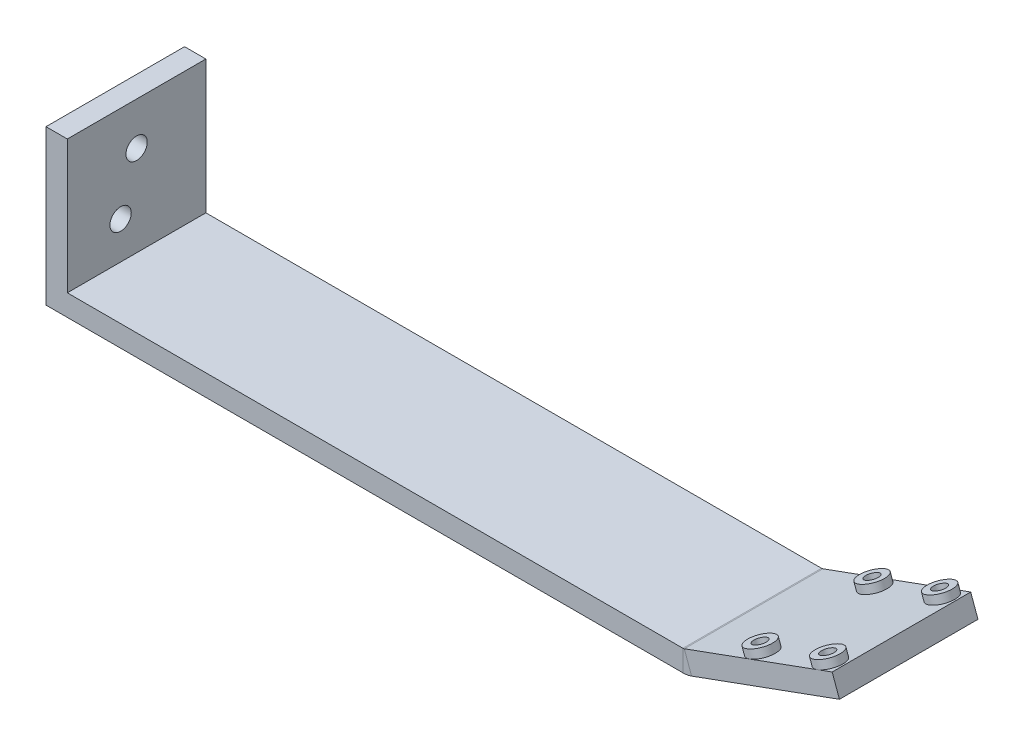
ISO-10303-21;
HEADER;
FILE_DESCRIPTION(('STEP AP214'),'2;1');
FILE_NAME('part.step','',(''),(''),'','','');
FILE_SCHEMA(('AUTOMOTIVE_DESIGN { 1 0 10303 214 1 1 1 1 }'));
ENDSEC;
DATA;
#1=APPLICATION_CONTEXT('core data for automotive mechanical design processes');
#2=APPLICATION_PROTOCOL_DEFINITION('international standard','automotive_design',2000,#1);
#3=PRODUCT_CONTEXT('',#1,'mechanical');
#4=PRODUCT('Part','Part','',(#3));
#5=PRODUCT_RELATED_PRODUCT_CATEGORY('part','',(#4));
#6=PRODUCT_DEFINITION_FORMATION('','',#4);
#7=PRODUCT_DEFINITION_CONTEXT('part definition',#1,'design');
#8=PRODUCT_DEFINITION('design','',#6,#7);
#9=PRODUCT_DEFINITION_SHAPE('','',#8);
#10=(LENGTH_UNIT() NAMED_UNIT(*) SI_UNIT(.MILLI.,.METRE.));
#11=(NAMED_UNIT(*) PLANE_ANGLE_UNIT() SI_UNIT($,.RADIAN.));
#12=(NAMED_UNIT(*) SI_UNIT($,.STERADIAN.) SOLID_ANGLE_UNIT());
#13=UNCERTAINTY_MEASURE_WITH_UNIT(LENGTH_MEASURE(1.E-05),#10,'distance_accuracy_value','');
#14=(GEOMETRIC_REPRESENTATION_CONTEXT(3) GLOBAL_UNCERTAINTY_ASSIGNED_CONTEXT((#13)) GLOBAL_UNIT_ASSIGNED_CONTEXT((#10,
#11,#12)) REPRESENTATION_CONTEXT('',''));
#15=CARTESIAN_POINT('',(0.,0.,0.));
#16=DIRECTION('',(0.,0.,1.));
#17=DIRECTION('',(1.,0.,0.));
#18=AXIS2_PLACEMENT_3D('',#15,#16,#17);
#19=CARTESIAN_POINT('',(0.,0.,0.));
#20=DIRECTION('',(0.,1.,0.));
#21=DIRECTION('',(0.,0.,1.));
#22=AXIS2_PLACEMENT_3D('',#19,#20,#21);
#23=PLANE('',#22);
#24=DIRECTION('',(-1.,0.,0.));
#25=VECTOR('',#24,1.);
#26=CARTESIAN_POINT('',(-75.,0.,-13.));
#27=LINE('',#26,#25);
#28=CARTESIAN_POINT('',(44.5223731968992,0.,-13.));
#29=VERTEX_POINT('',#28);
#30=CARTESIAN_POINT('',(-71.,0.,-13.));
#31=VERTEX_POINT('',#30);
#32=EDGE_CURVE('E65',#29,#31,#27,.T.);
#33=ORIENTED_EDGE('',*,*,#32,.T.);
#34=DIRECTION('',(0.,0.,-1.));
#35=VECTOR('',#34,1.);
#36=CARTESIAN_POINT('',(-71.,0.,13.));
#37=LINE('',#36,#35);
#38=CARTESIAN_POINT('',(-71.,0.,13.));
#39=VERTEX_POINT('',#38);
#40=EDGE_CURVE('E60',#39,#31,#37,.T.);
#41=ORIENTED_EDGE('',*,*,#40,.F.);
#42=DIRECTION('',(1.,0.,0.));
#43=VECTOR('',#42,1.);
#44=CARTESIAN_POINT('',(-75.,0.,13.));
#45=LINE('',#44,#43);
#46=CARTESIAN_POINT('',(44.5223731968992,0.,13.));
#47=VERTEX_POINT('',#46);
#48=EDGE_CURVE('E253',#39,#47,#45,.T.);
#49=ORIENTED_EDGE('',*,*,#48,.T.);
#50=DIRECTION('',(0.,0.,-1.));
#51=VECTOR('',#50,1.);
#52=CARTESIAN_POINT('',(44.5223731968992,0.,0.));
#53=LINE('',#52,#51);
#54=EDGE_CURVE('E251',#47,#29,#53,.T.);
#55=ORIENTED_EDGE('',*,*,#54,.T.);
#56=EDGE_LOOP('',(#33,#41,#49,#55));
#57=FACE_BOUND('',#56,.T.);
#58=ADVANCED_FACE('F43',(#57),#23,.T.);
#59=CARTESIAN_POINT('',(3.40739549004638,-19.2686125049224,0.));
#60=DIRECTION('',(-0.342020143325669,0.939692620785908,0.));
#61=DIRECTION('',(0.,0.,1.));
#62=AXIS2_PLACEMENT_3D('',#59,#60,#61);
#63=PLANE('',#62);
#64=CARTESIAN_POINT('',(71.0652641866318,5.35683781452583,-10.5));
#65=DIRECTION('',(-0.342020143325669,0.939692620785908,0.));
#66=DIRECTION('',(-0.939692620785908,-0.342020143325669,0.));
#67=AXIS2_PLACEMENT_3D('',#64,#65,#66);
#68=CIRCLE('',#67,1.25);
#69=CARTESIAN_POINT('',(69.8906484106494,4.92931263536875,-10.5));
#70=VERTEX_POINT('',#69);
#71=EDGE_CURVE('E186',#70,#70,#68,.T.);
#72=ORIENTED_EDGE('',*,*,#71,.T.);
#73=EDGE_LOOP('',(#72));
#74=FACE_BOUND('',#73,.T.);
#75=CARTESIAN_POINT('',(58.379413806022,0.739565879629296,10.5));
#76=DIRECTION('',(-0.342020143325669,0.939692620785908,0.));
#77=DIRECTION('',(-0.939692620785908,-0.342020143325669,0.));
#78=AXIS2_PLACEMENT_3D('',#75,#76,#77);
#79=CIRCLE('',#78,1.25);
#80=CARTESIAN_POINT('',(57.2047980300396,0.312040700472209,10.5));
#81=VERTEX_POINT('',#80);
#82=EDGE_CURVE('E180',#81,#81,#79,.F.);
#83=ORIENTED_EDGE('',*,*,#82,.F.);
#84=EDGE_LOOP('',(#83));
#85=FACE_BOUND('',#84,.T.);
#86=CARTESIAN_POINT('',(58.379413806022,0.739565879629296,-10.5));
#87=DIRECTION('',(-0.342020143325669,0.939692620785908,0.));
#88=DIRECTION('',(-0.939692620785908,-0.342020143325669,0.));
#89=AXIS2_PLACEMENT_3D('',#86,#87,#88);
#90=CIRCLE('',#89,1.25);
#91=CARTESIAN_POINT('',(57.2047980300396,0.312040700472209,-10.5));
#92=VERTEX_POINT('',#91);
#93=EDGE_CURVE('E173',#92,#92,#90,.T.);
#94=ORIENTED_EDGE('',*,*,#93,.T.);
#95=EDGE_LOOP('',(#94));
#96=FACE_BOUND('',#95,.T.);
#97=CARTESIAN_POINT('',(71.0652641866318,5.35683781452583,10.5));
#98=DIRECTION('',(-0.342020143325669,0.939692620785908,0.));
#99=DIRECTION('',(-0.939692620785908,-0.342020143325669,0.));
#100=AXIS2_PLACEMENT_3D('',#97,#98,#99);
#101=CIRCLE('',#100,1.25);
#102=CARTESIAN_POINT('',(69.8906484106494,4.92931263536875,10.5));
#103=VERTEX_POINT('',#102);
#104=EDGE_CURVE('E191',#103,#103,#101,.F.);
#105=ORIENTED_EDGE('',*,*,#104,.F.);
#106=EDGE_LOOP('',(#105));
#107=FACE_BOUND('',#106,.T.);
#108=DIRECTION('',(0.939692620785908,0.342020143325669,0.));
#109=VECTOR('',#108,1.);
#110=CARTESIAN_POINT('',(-67.0695510688967,-44.9201232543476,13.));
#111=LINE('',#110,#109);
#112=CARTESIAN_POINT('',(46.1423858077756,-3.71434806761453,13.));
#113=VERTEX_POINT('',#112);
#114=CARTESIAN_POINT('',(73.8843420489895,6.38289824450285,13.));
#115=VERTEX_POINT('',#114);
#116=EDGE_CURVE('E47',#113,#115,#111,.T.);
#117=ORIENTED_EDGE('',*,*,#116,.F.);
#118=DIRECTION('',(0.,0.,-1.));
#119=VECTOR('',#118,1.);
#120=CARTESIAN_POINT('',(46.1423858077756,-3.71434806761453,0.));
#121=LINE('',#120,#119);
#122=CARTESIAN_POINT('',(46.1423858077756,-3.71434806761454,-13.));
#123=VERTEX_POINT('',#122);
#124=EDGE_CURVE('E272',#113,#123,#121,.T.);
#125=ORIENTED_EDGE('',*,*,#124,.T.);
#126=DIRECTION('',(-0.939692620785908,-0.342020143325669,0.));
#127=VECTOR('',#126,1.);
#128=CARTESIAN_POINT('',(-67.0695510688967,-44.9201232543476,-13.));
#129=LINE('',#128,#127);
#130=CARTESIAN_POINT('',(73.8843420489895,6.38289824450285,-13.));
#131=VERTEX_POINT('',#130);
#132=EDGE_CURVE('E264',#131,#123,#129,.T.);
#133=ORIENTED_EDGE('',*,*,#132,.F.);
#134=DIRECTION('',(0.,0.,-1.));
#135=VECTOR('',#134,1.);
#136=CARTESIAN_POINT('',(73.8843420489895,6.38289824450285,-13.));
#137=LINE('',#136,#135);
#138=EDGE_CURVE('E261',#115,#131,#137,.T.);
#139=ORIENTED_EDGE('',*,*,#138,.F.);
#140=EDGE_LOOP('',(#117,#125,#133,#139));
#141=FACE_BOUND('',#140,.T.);
#142=ADVANCED_FACE('F333',(#74,#85,#96,#107,#141),#63,.F.);
#143=CARTESIAN_POINT('',(-67.0695510688967,-44.9201232543476,-13.));
#144=DIRECTION('',(0.,0.,-1.));
#145=DIRECTION('',(-0.939692620785908,-0.342020143325669,0.));
#146=AXIS2_PLACEMENT_3D('',#143,#144,#145);
#147=PLANE('',#146);
#148=DIRECTION('',(0.342020143325669,-0.939692620785908,0.));
#149=VECTOR('',#148,1.);
#150=CARTESIAN_POINT('',(46.1423858077756,-3.71434806761453,-13.));
#151=LINE('',#150,#149);
#152=CARTESIAN_POINT('',(44.7743052344729,0.0444224155290995,-13.));
#153=VERTEX_POINT('',#152);
#154=EDGE_CURVE('E12',#153,#123,#151,.T.);
#155=ORIENTED_EDGE('',*,*,#154,.F.);
#156=DIRECTION('',(-0.939692620785908,-0.342020143325669,0.));
#157=VECTOR('',#156,1.);
#158=CARTESIAN_POINT('',(-68.4376316421994,-41.1613527712039,-13.));
#159=LINE('',#158,#157);
#160=CARTESIAN_POINT('',(57.0113332327193,4.49833636277293,-13.));
#161=VERTEX_POINT('',#160);
#162=EDGE_CURVE('E268',#161,#153,#159,.T.);
#163=ORIENTED_EDGE('',*,*,#162,.F.);
#164=CARTESIAN_POINT('',(69.6971836133291,9.11560829766946,-13.));
#165=VERTEX_POINT('',#164);
#166=EDGE_CURVE('E286',#165,#161,#159,.T.);
#167=ORIENTED_EDGE('',*,*,#166,.F.);
#168=CARTESIAN_POINT('',(72.5162614756868,10.1416687276465,-13.));
#169=VERTEX_POINT('',#168);
#170=EDGE_CURVE('E284',#169,#165,#159,.T.);
#171=ORIENTED_EDGE('',*,*,#170,.F.);
#172=DIRECTION('',(-0.342020143325669,0.939692620785908,0.));
#173=VECTOR('',#172,1.);
#174=CARTESIAN_POINT('',(73.8843420489895,6.38289824450285,-13.));
#175=LINE('',#174,#173);
#176=EDGE_CURVE('E270',#131,#169,#175,.T.);
#177=ORIENTED_EDGE('',*,*,#176,.F.);
#178=ORIENTED_EDGE('',*,*,#132,.T.);
#179=EDGE_LOOP('',(#155,#163,#167,#171,#177,#178));
#180=FACE_BOUND('',#179,.T.);
#181=ADVANCED_FACE('F45',(#180),#147,.T.);
#182=CARTESIAN_POINT('',(73.8843420489895,6.38289824450285,-13.));
#183=DIRECTION('',(0.939692620785908,0.342020143325669,0.));
#184=DIRECTION('',(0.,0.,-1.));
#185=AXIS2_PLACEMENT_3D('',#182,#183,#184);
#186=PLANE('',#185);
#187=DIRECTION('',(0.,0.,-1.));
#188=VECTOR('',#187,1.);
#189=CARTESIAN_POINT('',(72.5162614756868,10.1416687276465,-13.));
#190=LINE('',#189,#188);
#191=CARTESIAN_POINT('',(72.5162614756868,10.1416687276465,13.));
#192=VERTEX_POINT('',#191);
#193=EDGE_CURVE('E265',#192,#169,#190,.T.);
#194=ORIENTED_EDGE('',*,*,#193,.F.);
#195=DIRECTION('',(-0.342020143325669,0.939692620785908,0.));
#196=VECTOR('',#195,1.);
#197=CARTESIAN_POINT('',(73.8843420489895,6.38289824450285,13.));
#198=LINE('',#197,#196);
#199=EDGE_CURVE('E273',#115,#192,#198,.T.);
#200=ORIENTED_EDGE('',*,*,#199,.F.);
#201=ORIENTED_EDGE('',*,*,#138,.T.);
#202=ORIENTED_EDGE('',*,*,#176,.T.);
#203=EDGE_LOOP('',(#194,#200,#201,#202));
#204=FACE_BOUND('',#203,.T.);
#205=ADVANCED_FACE('F304',(#204),#186,.T.);
#206=CARTESIAN_POINT('',(-67.0695510688967,-44.9201232543476,13.));
#207=DIRECTION('',(0.,0.,1.));
#208=DIRECTION('',(0.939692620785908,0.342020143325669,0.));
#209=AXIS2_PLACEMENT_3D('',#206,#207,#208);
#210=PLANE('',#209);
#211=DIRECTION('',(-0.342020143325669,0.939692620785908,0.));
#212=VECTOR('',#211,1.);
#213=CARTESIAN_POINT('',(46.1423858077756,-3.71434806761453,13.));
#214=LINE('',#213,#212);
#215=CARTESIAN_POINT('',(44.7743052344729,0.0444224155290995,13.));
#216=VERTEX_POINT('',#215);
#217=EDGE_CURVE('E278',#113,#216,#214,.T.);
#218=ORIENTED_EDGE('',*,*,#217,.F.);
#219=ORIENTED_EDGE('',*,*,#116,.T.);
#220=ORIENTED_EDGE('',*,*,#199,.T.);
#221=DIRECTION('',(0.939692620785908,0.342020143325669,0.));
#222=VECTOR('',#221,1.);
#223=CARTESIAN_POINT('',(-68.4376316421994,-41.1613527712039,13.));
#224=LINE('',#223,#222);
#225=CARTESIAN_POINT('',(69.6971836133291,9.11560829766946,13.));
#226=VERTEX_POINT('',#225);
#227=EDGE_CURVE('E244',#226,#192,#224,.T.);
#228=ORIENTED_EDGE('',*,*,#227,.F.);
#229=CARTESIAN_POINT('',(57.0113332327193,4.49833636277293,13.));
#230=VERTEX_POINT('',#229);
#231=EDGE_CURVE('E288',#230,#226,#224,.T.);
#232=ORIENTED_EDGE('',*,*,#231,.F.);
#233=EDGE_CURVE('E269',#216,#230,#224,.T.);
#234=ORIENTED_EDGE('',*,*,#233,.F.);
#235=EDGE_LOOP('',(#218,#219,#220,#228,#232,#234));
#236=FACE_BOUND('',#235,.T.);
#237=ADVANCED_FACE('F301',(#236),#210,.T.);
#238=CARTESIAN_POINT('',(2.0393149167437,-15.5098420217787,0.));
#239=DIRECTION('',(-0.342020143325669,0.939692620785908,0.));
#240=DIRECTION('',(0.,0.,1.));
#241=AXIS2_PLACEMENT_3D('',#238,#239,#240);
#242=PLANE('',#241);
#243=ORIENTED_EDGE('',*,*,#233,.T.);
#244=CARTESIAN_POINT('',(57.0113332327193,4.49833636277293,10.5));
#245=DIRECTION('',(-0.342020143325669,0.939692620785908,0.));
#246=DIRECTION('',(0.939692620785908,0.342020143325669,0.));
#247=AXIS2_PLACEMENT_3D('',#244,#245,#246);
#248=CIRCLE('',#247,2.5);
#249=EDGE_CURVE('E199',#230,#230,#248,.T.);
#250=ORIENTED_EDGE('',*,*,#249,.F.);
#251=ORIENTED_EDGE('',*,*,#231,.T.);
#252=CARTESIAN_POINT('',(69.6971836133291,9.11560829766946,10.5));
#253=DIRECTION('',(-0.342020143325669,0.939692620785908,0.));
#254=DIRECTION('',(0.939692620785908,0.342020143325669,0.));
#255=AXIS2_PLACEMENT_3D('',#252,#253,#254);
#256=CIRCLE('',#255,2.5);
#257=EDGE_CURVE('E215',#226,#226,#256,.T.);
#258=ORIENTED_EDGE('',*,*,#257,.F.);
#259=ORIENTED_EDGE('',*,*,#227,.T.);
#260=ORIENTED_EDGE('',*,*,#193,.T.);
#261=ORIENTED_EDGE('',*,*,#170,.T.);
#262=CARTESIAN_POINT('',(69.6971836133291,9.11560829766946,-10.5));
#263=DIRECTION('',(-0.342020143325669,0.939692620785908,0.));
#264=DIRECTION('',(-0.939692620785908,-0.342020143325669,0.));
#265=AXIS2_PLACEMENT_3D('',#262,#263,#264);
#266=CIRCLE('',#265,2.5);
#267=EDGE_CURVE('E224',#165,#165,#266,.T.);
#268=ORIENTED_EDGE('',*,*,#267,.F.);
#269=ORIENTED_EDGE('',*,*,#166,.T.);
#270=CARTESIAN_POINT('',(57.0113332327193,4.49833636277293,-10.5));
#271=DIRECTION('',(-0.342020143325669,0.939692620785908,0.));
#272=DIRECTION('',(-0.939692620785908,-0.342020143325669,0.));
#273=AXIS2_PLACEMENT_3D('',#270,#271,#272);
#274=CIRCLE('',#273,2.5);
#275=EDGE_CURVE('E207',#161,#161,#274,.T.);
#276=ORIENTED_EDGE('',*,*,#275,.F.);
#277=ORIENTED_EDGE('',*,*,#162,.T.);
#278=DIRECTION('',(0.,0.,-1.));
#279=VECTOR('',#278,1.);
#280=CARTESIAN_POINT('',(44.7743052344729,0.044422415529103,0.));
#281=LINE('',#280,#279);
#282=EDGE_CURVE('E52',#216,#153,#281,.T.);
#283=ORIENTED_EDGE('',*,*,#282,.F.);
#284=EDGE_LOOP('',(#243,#250,#251,#258,#259,#260,#261,#268,#269,#276,#277,#283));
#285=FACE_BOUND('',#284,.T.);
#286=ADVANCED_FACE('F294',(#285),#242,.T.);
#287=CARTESIAN_POINT('',(-75.,-4.,-13.));
#288=DIRECTION('',(-1.,0.,0.));
#289=DIRECTION('',(0.,0.,1.));
#290=AXIS2_PLACEMENT_3D('',#287,#288,#289);
#291=PLANE('',#290);
#292=CARTESIAN_POINT('',(-75.,7.,3.00000000000004));
#293=DIRECTION('',(1.,0.,0.));
#294=DIRECTION('',(0.,0.,-1.));
#295=AXIS2_PLACEMENT_3D('',#292,#293,#294);
#296=CIRCLE('',#295,2.);
#297=CARTESIAN_POINT('',(-75.,7.,1.00000000000004));
#298=VERTEX_POINT('',#297);
#299=EDGE_CURVE('E160',#298,#298,#296,.T.);
#300=ORIENTED_EDGE('',*,*,#299,.T.);
#301=EDGE_LOOP('',(#300));
#302=FACE_BOUND('',#301,.T.);
#303=CARTESIAN_POINT('',(-75.,17.,0.));
#304=DIRECTION('',(1.,0.,0.));
#305=DIRECTION('',(0.,0.,-1.));
#306=AXIS2_PLACEMENT_3D('',#303,#304,#305);
#307=CIRCLE('',#306,2.);
#308=CARTESIAN_POINT('',(-75.,17.,-1.99999999999996));
#309=VERTEX_POINT('',#308);
#310=EDGE_CURVE('E486',#309,#309,#307,.T.);
#311=ORIENTED_EDGE('',*,*,#310,.T.);
#312=EDGE_LOOP('',(#311));
#313=FACE_BOUND('',#312,.T.);
#314=DIRECTION('',(0.,1.,0.));
#315=VECTOR('',#314,1.);
#316=CARTESIAN_POINT('',(-75.,-4.,13.));
#317=LINE('',#316,#315);
#318=CARTESIAN_POINT('',(-75.,-4.,13.));
#319=VERTEX_POINT('',#318);
#320=CARTESIAN_POINT('',(-75.,25.,13.));
#321=VERTEX_POINT('',#320);
#322=EDGE_CURVE('E133',#319,#321,#317,.T.);
#323=ORIENTED_EDGE('',*,*,#322,.T.);
#324=DIRECTION('',(0.,0.,1.));
#325=VECTOR('',#324,1.);
#326=CARTESIAN_POINT('',(-75.,25.,13.));
#327=LINE('',#326,#325);
#328=CARTESIAN_POINT('',(-75.,25.,-13.));
#329=VERTEX_POINT('',#328);
#330=EDGE_CURVE('E138',#329,#321,#327,.T.);
#331=ORIENTED_EDGE('',*,*,#330,.F.);
#332=DIRECTION('',(0.,1.,0.));
#333=VECTOR('',#332,1.);
#334=CARTESIAN_POINT('',(-75.,-4.,-13.));
#335=LINE('',#334,#333);
#336=CARTESIAN_POINT('',(-75.,-4.,-13.));
#337=VERTEX_POINT('',#336);
#338=EDGE_CURVE('E242',#337,#329,#335,.T.);
#339=ORIENTED_EDGE('',*,*,#338,.F.);
#340=DIRECTION('',(0.,0.,1.));
#341=VECTOR('',#340,1.);
#342=CARTESIAN_POINT('',(-75.,-4.,-13.));
#343=LINE('',#342,#341);
#344=EDGE_CURVE('E140',#337,#319,#343,.T.);
#345=ORIENTED_EDGE('',*,*,#344,.T.);
#346=EDGE_LOOP('',(#323,#331,#339,#345));
#347=FACE_BOUND('',#346,.T.);
#348=ADVANCED_FACE('F135',(#302,#313,#347),#291,.T.);
#349=CARTESIAN_POINT('',(0.,-4.,0.));
#350=DIRECTION('',(0.,1.,0.));
#351=DIRECTION('',(0.,0.,1.));
#352=AXIS2_PLACEMENT_3D('',#349,#350,#351);
#353=PLANE('',#352);
#354=DIRECTION('',(0.,0.,-1.));
#355=VECTOR('',#354,1.);
#356=CARTESIAN_POINT('',(44.5223731968992,-4.,0.));
#357=LINE('',#356,#355);
#358=CARTESIAN_POINT('',(44.5223731968992,-4.,13.));
#359=VERTEX_POINT('',#358);
#360=CARTESIAN_POINT('',(44.5223731968992,-4.,-13.));
#361=VERTEX_POINT('',#360);
#362=EDGE_CURVE('E237',#359,#361,#357,.T.);
#363=ORIENTED_EDGE('',*,*,#362,.F.);
#364=DIRECTION('',(1.,0.,0.));
#365=VECTOR('',#364,1.);
#366=CARTESIAN_POINT('',(-75.,-4.,13.));
#367=LINE('',#366,#365);
#368=EDGE_CURVE('E144',#319,#359,#367,.T.);
#369=ORIENTED_EDGE('',*,*,#368,.F.);
#370=ORIENTED_EDGE('',*,*,#344,.F.);
#371=DIRECTION('',(-1.,0.,0.));
#372=VECTOR('',#371,1.);
#373=CARTESIAN_POINT('',(-75.,-4.,-13.));
#374=LINE('',#373,#372);
#375=EDGE_CURVE('E245',#361,#337,#374,.T.);
#376=ORIENTED_EDGE('',*,*,#375,.F.);
#377=EDGE_LOOP('',(#363,#369,#370,#376));
#378=FACE_BOUND('',#377,.T.);
#379=ADVANCED_FACE('F355',(#378),#353,.F.);
#380=CARTESIAN_POINT('',(-75.,-4.,13.));
#381=DIRECTION('',(0.,0.,1.));
#382=DIRECTION('',(1.,0.,0.));
#383=AXIS2_PLACEMENT_3D('',#380,#381,#382);
#384=PLANE('',#383);
#385=ORIENTED_EDGE('',*,*,#368,.T.);
#386=DIRECTION('',(0.,1.,0.));
#387=VECTOR('',#386,1.);
#388=CARTESIAN_POINT('',(44.5223731968992,-4.,13.));
#389=LINE('',#388,#387);
#390=EDGE_CURVE('E255',#359,#47,#389,.T.);
#391=ORIENTED_EDGE('',*,*,#390,.T.);
#392=ORIENTED_EDGE('',*,*,#48,.F.);
#393=DIRECTION('',(0.,-1.,0.));
#394=VECTOR('',#393,1.);
#395=CARTESIAN_POINT('',(-71.,25.,13.));
#396=LINE('',#395,#394);
#397=CARTESIAN_POINT('',(-71.,25.,13.));
#398=VERTEX_POINT('',#397);
#399=EDGE_CURVE('E150',#398,#39,#396,.T.);
#400=ORIENTED_EDGE('',*,*,#399,.F.);
#401=DIRECTION('',(1.,0.,0.));
#402=VECTOR('',#401,1.);
#403=CARTESIAN_POINT('',(-75.,25.,13.));
#404=LINE('',#403,#402);
#405=EDGE_CURVE('E147',#321,#398,#404,.T.);
#406=ORIENTED_EDGE('',*,*,#405,.F.);
#407=ORIENTED_EDGE('',*,*,#322,.F.);
#408=EDGE_LOOP('',(#385,#391,#392,#400,#406,#407));
#409=FACE_BOUND('',#408,.T.);
#410=ADVANCED_FACE('F148',(#409),#384,.T.);
#411=CARTESIAN_POINT('',(-75.,-4.,-13.));
#412=DIRECTION('',(0.,0.,-1.));
#413=DIRECTION('',(-1.,0.,0.));
#414=AXIS2_PLACEMENT_3D('',#411,#412,#413);
#415=PLANE('',#414);
#416=ORIENTED_EDGE('',*,*,#32,.F.);
#417=DIRECTION('',(0.,-1.,0.));
#418=VECTOR('',#417,1.);
#419=CARTESIAN_POINT('',(44.5223731968992,-4.,-13.));
#420=LINE('',#419,#418);
#421=EDGE_CURVE('E247',#29,#361,#420,.T.);
#422=ORIENTED_EDGE('',*,*,#421,.T.);
#423=ORIENTED_EDGE('',*,*,#375,.T.);
#424=ORIENTED_EDGE('',*,*,#338,.T.);
#425=DIRECTION('',(-1.,0.,0.));
#426=VECTOR('',#425,1.);
#427=CARTESIAN_POINT('',(-75.,25.,-13.));
#428=LINE('',#427,#426);
#429=CARTESIAN_POINT('',(-71.,25.,-13.));
#430=VERTEX_POINT('',#429);
#431=EDGE_CURVE('E158',#430,#329,#428,.T.);
#432=ORIENTED_EDGE('',*,*,#431,.F.);
#433=DIRECTION('',(0.,-1.,0.));
#434=VECTOR('',#433,1.);
#435=CARTESIAN_POINT('',(-71.,25.,-13.));
#436=LINE('',#435,#434);
#437=EDGE_CURVE('E167',#430,#31,#436,.T.);
#438=ORIENTED_EDGE('',*,*,#437,.T.);
#439=EDGE_LOOP('',(#416,#422,#423,#424,#432,#438));
#440=FACE_BOUND('',#439,.T.);
#441=ADVANCED_FACE('F343',(#440),#415,.T.);
#442=CARTESIAN_POINT('',(44.5223731968992,0.7366,13.));
#443=DIRECTION('',(0.,0.,1.));
#444=DIRECTION('',(1.,0.,0.));
#445=AXIS2_PLACEMENT_3D('',#442,#443,#444);
#446=PLANE('',#445);
#447=ORIENTED_EDGE('',*,*,#217,.T.);
#448=CARTESIAN_POINT('',(44.5223731968992,0.7366,13.));
#449=DIRECTION('',(0.,0.,1.));
#450=DIRECTION('',(1.,0.,0.));
#451=AXIS2_PLACEMENT_3D('',#448,#449,#450);
#452=CIRCLE('',#451,0.7366);
#453=EDGE_CURVE('E228',#216,#47,#452,.F.);
#454=ORIENTED_EDGE('',*,*,#453,.T.);
#455=ORIENTED_EDGE('',*,*,#390,.F.);
#456=CARTESIAN_POINT('',(44.5223731968992,0.7366,13.));
#457=DIRECTION('',(0.,0.,-1.));
#458=DIRECTION('',(1.,0.,0.));
#459=AXIS2_PLACEMENT_3D('',#456,#457,#458);
#460=CIRCLE('',#459,4.7366);
#461=EDGE_CURVE('E230',#113,#359,#460,.T.);
#462=ORIENTED_EDGE('',*,*,#461,.F.);
#463=EDGE_LOOP('',(#447,#454,#455,#462));
#464=FACE_BOUND('',#463,.T.);
#465=ADVANCED_FACE('F346',(#464),#446,.T.);
#466=CARTESIAN_POINT('',(44.5223731968992,0.7366,-13.));
#467=DIRECTION('',(0.,0.,-1.));
#468=DIRECTION('',(-1.,0.,0.));
#469=AXIS2_PLACEMENT_3D('',#466,#467,#468);
#470=PLANE('',#469);
#471=ORIENTED_EDGE('',*,*,#421,.F.);
#472=CARTESIAN_POINT('',(44.5223731968992,0.7366,-13.));
#473=DIRECTION('',(0.,0.,1.));
#474=DIRECTION('',(1.,0.,0.));
#475=AXIS2_PLACEMENT_3D('',#472,#473,#474);
#476=CIRCLE('',#475,0.7366);
#477=EDGE_CURVE('E234',#29,#153,#476,.T.);
#478=ORIENTED_EDGE('',*,*,#477,.T.);
#479=ORIENTED_EDGE('',*,*,#154,.T.);
#480=CARTESIAN_POINT('',(44.5223731968992,0.7366,-13.));
#481=DIRECTION('',(0.,0.,1.));
#482=DIRECTION('',(-1.,0.,0.));
#483=AXIS2_PLACEMENT_3D('',#480,#481,#482);
#484=CIRCLE('',#483,4.7366);
#485=EDGE_CURVE('E233',#361,#123,#484,.T.);
#486=ORIENTED_EDGE('',*,*,#485,.F.);
#487=EDGE_LOOP('',(#471,#478,#479,#486));
#488=FACE_BOUND('',#487,.T.);
#489=ADVANCED_FACE('F367',(#488),#470,.T.);
#490=CARTESIAN_POINT('',(44.5223731968992,0.7366,-26.3232313641802));
#491=DIRECTION('',(0.,0.,1.));
#492=DIRECTION('',(1.,0.,0.));
#493=AXIS2_PLACEMENT_3D('',#490,#491,#492);
#494=CYLINDRICAL_SURFACE('',#493,4.7366);
#495=ORIENTED_EDGE('',*,*,#485,.T.);
#496=ORIENTED_EDGE('',*,*,#124,.F.);
#497=ORIENTED_EDGE('',*,*,#461,.T.);
#498=ORIENTED_EDGE('',*,*,#362,.T.);
#499=EDGE_LOOP('',(#495,#496,#497,#498));
#500=FACE_BOUND('',#499,.T.);
#501=ADVANCED_FACE('F371',(#500),#494,.T.);
#502=CARTESIAN_POINT('',(44.5223731968992,0.7366,-26.3232313641802));
#503=DIRECTION('',(0.,0.,1.));
#504=DIRECTION('',(1.,0.,0.));
#505=AXIS2_PLACEMENT_3D('',#502,#503,#504);
#506=CYLINDRICAL_SURFACE('',#505,0.7366);
#507=ORIENTED_EDGE('',*,*,#477,.F.);
#508=ORIENTED_EDGE('',*,*,#54,.F.);
#509=ORIENTED_EDGE('',*,*,#453,.F.);
#510=ORIENTED_EDGE('',*,*,#282,.T.);
#511=EDGE_LOOP('',(#507,#508,#509,#510));
#512=FACE_BOUND('',#511,.T.);
#513=ADVANCED_FACE('F327',(#512),#506,.F.);
#514=CARTESIAN_POINT('',(69.1841533983406,10.5251472288483,-10.5));
#515=DIRECTION('',(-0.342020143325669,0.939692620785908,0.));
#516=DIRECTION('',(-0.939692620785908,-0.342020143325669,0.));
#517=AXIS2_PLACEMENT_3D('',#514,#515,#516);
#518=PLANE('',#517);
#519=CARTESIAN_POINT('',(69.1841533983406,10.5251472288483,-10.5));
#520=DIRECTION('',(-0.342020143325669,0.939692620785908,0.));
#521=DIRECTION('',(-0.939692620785908,-0.342020143325669,0.));
#522=AXIS2_PLACEMENT_3D('',#519,#520,#521);
#523=CIRCLE('',#522,2.5);
#524=CARTESIAN_POINT('',(66.8349218463758,9.67009687053415,-10.5));
#525=VERTEX_POINT('',#524);
#526=EDGE_CURVE('E225',#525,#525,#523,.T.);
#527=ORIENTED_EDGE('',*,*,#526,.T.);
#528=EDGE_LOOP('',(#527));
#529=FACE_BOUND('',#528,.T.);
#530=CARTESIAN_POINT('',(69.1841533983406,10.5251472288483,-10.5));
#531=DIRECTION('',(-0.342020143325669,0.939692620785908,0.));
#532=DIRECTION('',(-0.939692620785908,-0.342020143325669,0.));
#533=AXIS2_PLACEMENT_3D('',#530,#531,#532);
#534=CIRCLE('',#533,1.25);
#535=CARTESIAN_POINT('',(68.0095376223582,10.0976220496912,-10.5));
#536=VERTEX_POINT('',#535);
#537=EDGE_CURVE('E219',#536,#536,#534,.T.);
#538=ORIENTED_EDGE('',*,*,#537,.F.);
#539=EDGE_LOOP('',(#538));
#540=FACE_BOUND('',#539,.T.);
#541=ADVANCED_FACE('F317',(#529,#540),#518,.T.);
#542=CARTESIAN_POINT('',(69.1841533983406,10.5251472288483,-10.5));
#543=DIRECTION('',(0.342020143325669,-0.939692620785908,0.));
#544=DIRECTION('',(0.939692620785908,0.342020143325669,0.));
#545=AXIS2_PLACEMENT_3D('',#542,#543,#544);
#546=CYLINDRICAL_SURFACE('',#545,2.5);
#547=ORIENTED_EDGE('',*,*,#526,.F.);
#548=EDGE_LOOP('',(#547));
#549=FACE_BOUND('',#548,.T.);
#550=ORIENTED_EDGE('',*,*,#267,.T.);
#551=EDGE_LOOP('',(#550));
#552=FACE_BOUND('',#551,.T.);
#553=ADVANCED_FACE('F314',(#549,#552),#546,.T.);
#554=CARTESIAN_POINT('',(69.1841533983406,10.5251472288483,-10.5));
#555=DIRECTION('',(0.342020143325669,-0.939692620785908,0.));
#556=DIRECTION('',(0.939692620785908,0.342020143325669,0.));
#557=AXIS2_PLACEMENT_3D('',#554,#555,#556);
#558=CYLINDRICAL_SURFACE('',#557,1.25);
#559=ORIENTED_EDGE('',*,*,#537,.T.);
#560=EDGE_LOOP('',(#559));
#561=FACE_BOUND('',#560,.T.);
#562=CARTESIAN_POINT('',(69.6971836133291,9.11560829766946,-10.5));
#563=DIRECTION('',(-0.342020143325669,0.939692620785908,0.));
#564=DIRECTION('',(-0.939692620785908,-0.342020143325669,0.));
#565=AXIS2_PLACEMENT_3D('',#562,#563,#564);
#566=CIRCLE('',#565,1.25);
#567=CARTESIAN_POINT('',(68.5225678373467,8.68808311851238,-10.5));
#568=VERTEX_POINT('',#567);
#569=EDGE_CURVE('E172',#568,#568,#566,.T.);
#570=ORIENTED_EDGE('',*,*,#569,.F.);
#571=EDGE_LOOP('',(#570));
#572=FACE_BOUND('',#571,.T.);
#573=ADVANCED_FACE('F316',(#561,#572),#558,.F.);
#574=CARTESIAN_POINT('',(69.1841533983406,10.5251472288483,10.5));
#575=DIRECTION('',(0.342020143325669,-0.939692620785908,0.));
#576=DIRECTION('',(0.939692620785908,0.342020143325669,0.));
#577=AXIS2_PLACEMENT_3D('',#574,#575,#576);
#578=PLANE('',#577);
#579=CARTESIAN_POINT('',(69.1841533983406,10.5251472288483,10.5));
#580=DIRECTION('',(-0.342020143325669,0.939692620785908,0.));
#581=DIRECTION('',(0.939692620785908,0.342020143325669,0.));
#582=AXIS2_PLACEMENT_3D('',#579,#580,#581);
#583=CIRCLE('',#582,2.5);
#584=CARTESIAN_POINT('',(71.5333849503053,11.3801975871625,10.5));
#585=VERTEX_POINT('',#584);
#586=EDGE_CURVE('E216',#585,#585,#583,.T.);
#587=ORIENTED_EDGE('',*,*,#586,.T.);
#588=EDGE_LOOP('',(#587));
#589=FACE_BOUND('',#588,.T.);
#590=CARTESIAN_POINT('',(69.1841533983406,10.5251472288483,10.5));
#591=DIRECTION('',(-0.342020143325669,0.939692620785908,0.));
#592=DIRECTION('',(0.939692620785908,0.342020143325669,0.));
#593=AXIS2_PLACEMENT_3D('',#590,#591,#592);
#594=CIRCLE('',#593,1.25);
#595=CARTESIAN_POINT('',(70.3587691743229,10.9526724080054,10.5));
#596=VERTEX_POINT('',#595);
#597=EDGE_CURVE('E211',#596,#596,#594,.T.);
#598=ORIENTED_EDGE('',*,*,#597,.F.);
#599=EDGE_LOOP('',(#598));
#600=FACE_BOUND('',#599,.T.);
#601=ADVANCED_FACE('F324',(#589,#600),#578,.F.);
#602=CARTESIAN_POINT('',(69.1841533983406,10.5251472288483,10.5));
#603=DIRECTION('',(0.342020143325669,-0.939692620785908,0.));
#604=DIRECTION('',(0.939692620785908,0.342020143325669,0.));
#605=AXIS2_PLACEMENT_3D('',#602,#603,#604);
#606=CYLINDRICAL_SURFACE('',#605,2.5);
#607=ORIENTED_EDGE('',*,*,#586,.F.);
#608=EDGE_LOOP('',(#607));
#609=FACE_BOUND('',#608,.T.);
#610=ORIENTED_EDGE('',*,*,#257,.T.);
#611=EDGE_LOOP('',(#610));
#612=FACE_BOUND('',#611,.T.);
#613=ADVANCED_FACE('F409',(#609,#612),#606,.T.);
#614=CARTESIAN_POINT('',(69.1841533983406,10.5251472288483,10.5));
#615=DIRECTION('',(0.342020143325669,-0.939692620785908,0.));
#616=DIRECTION('',(0.939692620785908,0.342020143325669,0.));
#617=AXIS2_PLACEMENT_3D('',#614,#615,#616);
#618=CYLINDRICAL_SURFACE('',#617,1.25);
#619=ORIENTED_EDGE('',*,*,#597,.T.);
#620=EDGE_LOOP('',(#619));
#621=FACE_BOUND('',#620,.T.);
#622=CARTESIAN_POINT('',(69.6971836133291,9.11560829766946,10.5));
#623=DIRECTION('',(-0.342020143325669,0.939692620785908,0.));
#624=DIRECTION('',(-0.939692620785908,-0.342020143325669,0.));
#625=AXIS2_PLACEMENT_3D('',#622,#623,#624);
#626=CIRCLE('',#625,1.25);
#627=CARTESIAN_POINT('',(68.5225678373467,8.68808311851238,10.5));
#628=VERTEX_POINT('',#627);
#629=EDGE_CURVE('E176',#628,#628,#626,.F.);
#630=ORIENTED_EDGE('',*,*,#629,.T.);
#631=EDGE_LOOP('',(#630));
#632=FACE_BOUND('',#631,.T.);
#633=ADVANCED_FACE('F402',(#621,#632),#618,.F.);
#634=CARTESIAN_POINT('',(56.4983030177308,5.90787529395179,-10.5));
#635=DIRECTION('',(-0.342020143325669,0.939692620785908,0.));
#636=DIRECTION('',(-0.939692620785908,-0.342020143325669,0.));
#637=AXIS2_PLACEMENT_3D('',#634,#635,#636);
#638=PLANE('',#637);
#639=CARTESIAN_POINT('',(56.4983030177308,5.90787529395179,-10.5));
#640=DIRECTION('',(-0.342020143325669,0.939692620785908,0.));
#641=DIRECTION('',(-0.939692620785908,-0.342020143325669,0.));
#642=AXIS2_PLACEMENT_3D('',#639,#640,#641);
#643=CIRCLE('',#642,2.5);
#644=CARTESIAN_POINT('',(54.149071465766,5.05282493563762,-10.5));
#645=VERTEX_POINT('',#644);
#646=EDGE_CURVE('E208',#645,#645,#643,.T.);
#647=ORIENTED_EDGE('',*,*,#646,.T.);
#648=EDGE_LOOP('',(#647));
#649=FACE_BOUND('',#648,.T.);
#650=CARTESIAN_POINT('',(56.4983030177308,5.90787529395179,-10.5));
#651=DIRECTION('',(-0.342020143325669,0.939692620785908,0.));
#652=DIRECTION('',(-0.939692620785908,-0.342020143325669,0.));
#653=AXIS2_PLACEMENT_3D('',#650,#651,#652);
#654=CIRCLE('',#653,1.25);
#655=CARTESIAN_POINT('',(55.3236872417484,5.4803501147947,-10.5));
#656=VERTEX_POINT('',#655);
#657=EDGE_CURVE('E203',#656,#656,#654,.T.);
#658=ORIENTED_EDGE('',*,*,#657,.F.);
#659=EDGE_LOOP('',(#658));
#660=FACE_BOUND('',#659,.T.);
#661=ADVANCED_FACE('F392',(#649,#660),#638,.T.);
#662=CARTESIAN_POINT('',(56.4983030177308,5.90787529395179,-10.5));
#663=DIRECTION('',(0.342020143325669,-0.939692620785908,0.));
#664=DIRECTION('',(0.939692620785908,0.342020143325669,0.));
#665=AXIS2_PLACEMENT_3D('',#662,#663,#664);
#666=CYLINDRICAL_SURFACE('',#665,2.5);
#667=ORIENTED_EDGE('',*,*,#646,.F.);
#668=EDGE_LOOP('',(#667));
#669=FACE_BOUND('',#668,.T.);
#670=ORIENTED_EDGE('',*,*,#275,.T.);
#671=EDGE_LOOP('',(#670));
#672=FACE_BOUND('',#671,.T.);
#673=ADVANCED_FACE('F389',(#669,#672),#666,.T.);
#674=CARTESIAN_POINT('',(56.4983030177308,5.90787529395179,-10.5));
#675=DIRECTION('',(0.342020143325669,-0.939692620785908,0.));
#676=DIRECTION('',(0.939692620785908,0.342020143325669,0.));
#677=AXIS2_PLACEMENT_3D('',#674,#675,#676);
#678=CYLINDRICAL_SURFACE('',#677,1.25);
#679=ORIENTED_EDGE('',*,*,#657,.T.);
#680=EDGE_LOOP('',(#679));
#681=FACE_BOUND('',#680,.T.);
#682=CARTESIAN_POINT('',(57.0113332327193,4.49833636277293,-10.5));
#683=DIRECTION('',(-0.342020143325669,0.939692620785908,0.));
#684=DIRECTION('',(-0.939692620785908,-0.342020143325669,0.));
#685=AXIS2_PLACEMENT_3D('',#682,#683,#684);
#686=CIRCLE('',#685,1.25);
#687=CARTESIAN_POINT('',(55.8367174567369,4.07081118361584,-10.5));
#688=VERTEX_POINT('',#687);
#689=EDGE_CURVE('E177',#688,#688,#686,.T.);
#690=ORIENTED_EDGE('',*,*,#689,.F.);
#691=EDGE_LOOP('',(#690));
#692=FACE_BOUND('',#691,.T.);
#693=ADVANCED_FACE('F391',(#681,#692),#678,.F.);
#694=CARTESIAN_POINT('',(56.4983030177308,5.90787529395179,10.5));
#695=DIRECTION('',(0.342020143325669,-0.939692620785908,0.));
#696=DIRECTION('',(0.939692620785908,0.342020143325669,0.));
#697=AXIS2_PLACEMENT_3D('',#694,#695,#696);
#698=PLANE('',#697);
#699=CARTESIAN_POINT('',(56.4983030177308,5.90787529395179,10.5));
#700=DIRECTION('',(-0.342020143325669,0.939692620785908,0.));
#701=DIRECTION('',(0.939692620785908,0.342020143325669,0.));
#702=AXIS2_PLACEMENT_3D('',#699,#700,#701);
#703=CIRCLE('',#702,2.5);
#704=CARTESIAN_POINT('',(58.8475345696956,6.76292565226596,10.5));
#705=VERTEX_POINT('',#704);
#706=EDGE_CURVE('E200',#705,#705,#703,.T.);
#707=ORIENTED_EDGE('',*,*,#706,.T.);
#708=EDGE_LOOP('',(#707));
#709=FACE_BOUND('',#708,.T.);
#710=CARTESIAN_POINT('',(56.4983030177308,5.90787529395179,10.5));
#711=DIRECTION('',(-0.342020143325669,0.939692620785908,0.));
#712=DIRECTION('',(0.939692620785908,0.342020143325669,0.));
#713=AXIS2_PLACEMENT_3D('',#710,#711,#712);
#714=CIRCLE('',#713,1.25);
#715=CARTESIAN_POINT('',(57.6729187937132,6.33540047310888,10.5));
#716=VERTEX_POINT('',#715);
#717=EDGE_CURVE('E194',#716,#716,#714,.T.);
#718=ORIENTED_EDGE('',*,*,#717,.F.);
#719=EDGE_LOOP('',(#718));
#720=FACE_BOUND('',#719,.T.);
#721=ADVANCED_FACE('F399',(#709,#720),#698,.F.);
#722=CARTESIAN_POINT('',(56.4983030177308,5.90787529395179,10.5));
#723=DIRECTION('',(0.342020143325669,-0.939692620785908,0.));
#724=DIRECTION('',(0.939692620785908,0.342020143325669,0.));
#725=AXIS2_PLACEMENT_3D('',#722,#723,#724);
#726=CYLINDRICAL_SURFACE('',#725,2.5);
#727=ORIENTED_EDGE('',*,*,#706,.F.);
#728=EDGE_LOOP('',(#727));
#729=FACE_BOUND('',#728,.T.);
#730=ORIENTED_EDGE('',*,*,#249,.T.);
#731=EDGE_LOOP('',(#730));
#732=FACE_BOUND('',#731,.T.);
#733=ADVANCED_FACE('F438',(#729,#732),#726,.T.);
#734=CARTESIAN_POINT('',(56.4983030177308,5.90787529395179,10.5));
#735=DIRECTION('',(0.342020143325669,-0.939692620785908,0.));
#736=DIRECTION('',(0.939692620785908,0.342020143325669,0.));
#737=AXIS2_PLACEMENT_3D('',#734,#735,#736);
#738=CYLINDRICAL_SURFACE('',#737,1.25);
#739=ORIENTED_EDGE('',*,*,#717,.T.);
#740=EDGE_LOOP('',(#739));
#741=FACE_BOUND('',#740,.T.);
#742=CARTESIAN_POINT('',(57.0113332327193,4.49833636277293,10.5));
#743=DIRECTION('',(-0.342020143325669,0.939692620785908,0.));
#744=DIRECTION('',(-0.939692620785908,-0.342020143325669,0.));
#745=AXIS2_PLACEMENT_3D('',#742,#743,#744);
#746=CIRCLE('',#745,1.25);
#747=CARTESIAN_POINT('',(55.8367174567369,4.07081118361584,10.5));
#748=VERTEX_POINT('',#747);
#749=EDGE_CURVE('E183',#748,#748,#746,.F.);
#750=ORIENTED_EDGE('',*,*,#749,.T.);
#751=EDGE_LOOP('',(#750));
#752=FACE_BOUND('',#751,.T.);
#753=ADVANCED_FACE('F428',(#741,#752),#738,.F.);
#754=CARTESIAN_POINT('',(69.6971836133291,9.11560829766946,10.5));
#755=DIRECTION('',(-0.342020143325669,0.939692620785908,0.));
#756=DIRECTION('',(-0.939692620785908,-0.342020143325669,0.));
#757=AXIS2_PLACEMENT_3D('',#754,#755,#756);
#758=CYLINDRICAL_SURFACE('',#757,1.25);
#759=ORIENTED_EDGE('',*,*,#104,.T.);
#760=EDGE_LOOP('',(#759));
#761=FACE_BOUND('',#760,.T.);
#762=ORIENTED_EDGE('',*,*,#629,.F.);
#763=EDGE_LOOP('',(#762));
#764=FACE_BOUND('',#763,.T.);
#765=ADVANCED_FACE('F425',(#761,#764),#758,.F.);
#766=CARTESIAN_POINT('',(57.0113332327193,4.49833636277293,-10.5));
#767=DIRECTION('',(-0.342020143325669,0.939692620785908,0.));
#768=DIRECTION('',(-0.939692620785908,-0.342020143325669,0.));
#769=AXIS2_PLACEMENT_3D('',#766,#767,#768);
#770=CYLINDRICAL_SURFACE('',#769,1.25);
#771=ORIENTED_EDGE('',*,*,#93,.F.);
#772=EDGE_LOOP('',(#771));
#773=FACE_BOUND('',#772,.T.);
#774=ORIENTED_EDGE('',*,*,#689,.T.);
#775=EDGE_LOOP('',(#774));
#776=FACE_BOUND('',#775,.T.);
#777=ADVANCED_FACE('F427',(#773,#776),#770,.F.);
#778=CARTESIAN_POINT('',(57.0113332327193,4.49833636277293,10.5));
#779=DIRECTION('',(-0.342020143325669,0.939692620785908,0.));
#780=DIRECTION('',(-0.939692620785908,-0.342020143325669,0.));
#781=AXIS2_PLACEMENT_3D('',#778,#779,#780);
#782=CYLINDRICAL_SURFACE('',#781,1.25);
#783=ORIENTED_EDGE('',*,*,#82,.T.);
#784=EDGE_LOOP('',(#783));
#785=FACE_BOUND('',#784,.T.);
#786=ORIENTED_EDGE('',*,*,#749,.F.);
#787=EDGE_LOOP('',(#786));
#788=FACE_BOUND('',#787,.T.);
#789=ADVANCED_FACE('F435',(#785,#788),#782,.F.);
#790=CARTESIAN_POINT('',(69.6971836133291,9.11560829766946,-10.5));
#791=DIRECTION('',(-0.342020143325669,0.939692620785908,0.));
#792=DIRECTION('',(-0.939692620785908,-0.342020143325669,0.));
#793=AXIS2_PLACEMENT_3D('',#790,#791,#792);
#794=CYLINDRICAL_SURFACE('',#793,1.25);
#795=ORIENTED_EDGE('',*,*,#71,.F.);
#796=EDGE_LOOP('',(#795));
#797=FACE_BOUND('',#796,.T.);
#798=ORIENTED_EDGE('',*,*,#569,.T.);
#799=EDGE_LOOP('',(#798));
#800=FACE_BOUND('',#799,.T.);
#801=ADVANCED_FACE('F442',(#797,#800),#794,.F.);
#802=CARTESIAN_POINT('',(-71.,25.,13.));
#803=DIRECTION('',(-1.,0.,0.));
#804=DIRECTION('',(0.,0.,1.));
#805=AXIS2_PLACEMENT_3D('',#802,#803,#804);
#806=PLANE('',#805);
#807=CARTESIAN_POINT('',(-71.,7.,3.00000000000004));
#808=DIRECTION('',(1.,0.,0.));
#809=DIRECTION('',(0.,0.,-1.));
#810=AXIS2_PLACEMENT_3D('',#807,#808,#809);
#811=CIRCLE('',#810,2.);
#812=CARTESIAN_POINT('',(-71.,7.,1.00000000000004));
#813=VERTEX_POINT('',#812);
#814=EDGE_CURVE('E485',#813,#813,#811,.T.);
#815=ORIENTED_EDGE('',*,*,#814,.F.);
#816=EDGE_LOOP('',(#815));
#817=FACE_BOUND('',#816,.T.);
#818=CARTESIAN_POINT('',(-71.,17.,0.));
#819=DIRECTION('',(1.,0.,0.));
#820=DIRECTION('',(0.,0.,-1.));
#821=AXIS2_PLACEMENT_3D('',#818,#819,#820);
#822=CIRCLE('',#821,2.);
#823=CARTESIAN_POINT('',(-71.,17.,-1.99999999999996));
#824=VERTEX_POINT('',#823);
#825=EDGE_CURVE('E163',#824,#824,#822,.T.);
#826=ORIENTED_EDGE('',*,*,#825,.F.);
#827=EDGE_LOOP('',(#826));
#828=FACE_BOUND('',#827,.T.);
#829=ORIENTED_EDGE('',*,*,#40,.T.);
#830=ORIENTED_EDGE('',*,*,#437,.F.);
#831=DIRECTION('',(0.,0.,-1.));
#832=VECTOR('',#831,1.);
#833=CARTESIAN_POINT('',(-71.,25.,13.));
#834=LINE('',#833,#832);
#835=EDGE_CURVE('E153',#398,#430,#834,.T.);
#836=ORIENTED_EDGE('',*,*,#835,.F.);
#837=ORIENTED_EDGE('',*,*,#399,.T.);
#838=EDGE_LOOP('',(#829,#830,#836,#837));
#839=FACE_BOUND('',#838,.T.);
#840=ADVANCED_FACE('F464',(#817,#828,#839),#806,.F.);
#841=CARTESIAN_POINT('',(0.,25.,0.));
#842=DIRECTION('',(0.,-1.,0.));
#843=DIRECTION('',(0.,0.,-1.));
#844=AXIS2_PLACEMENT_3D('',#841,#842,#843);
#845=PLANE('',#844);
#846=ORIENTED_EDGE('',*,*,#330,.T.);
#847=ORIENTED_EDGE('',*,*,#405,.T.);
#848=ORIENTED_EDGE('',*,*,#835,.T.);
#849=ORIENTED_EDGE('',*,*,#431,.T.);
#850=EDGE_LOOP('',(#846,#847,#848,#849));
#851=FACE_BOUND('',#850,.T.);
#852=ADVANCED_FACE('F156',(#851),#845,.F.);
#853=CARTESIAN_POINT('',(-75.,17.,0.));
#854=DIRECTION('',(1.,0.,0.));
#855=DIRECTION('',(0.,0.,-1.));
#856=AXIS2_PLACEMENT_3D('',#853,#854,#855);
#857=CYLINDRICAL_SURFACE('',#856,2.);
#858=ORIENTED_EDGE('',*,*,#310,.F.);
#859=EDGE_LOOP('',(#858));
#860=FACE_BOUND('',#859,.T.);
#861=ORIENTED_EDGE('',*,*,#825,.T.);
#862=EDGE_LOOP('',(#861));
#863=FACE_BOUND('',#862,.T.);
#864=ADVANCED_FACE('F472',(#860,#863),#857,.F.);
#865=CARTESIAN_POINT('',(-75.,7.,3.00000000000004));
#866=DIRECTION('',(1.,0.,0.));
#867=DIRECTION('',(0.,0.,-1.));
#868=AXIS2_PLACEMENT_3D('',#865,#866,#867);
#869=CYLINDRICAL_SURFACE('',#868,2.);
#870=ORIENTED_EDGE('',*,*,#299,.F.);
#871=EDGE_LOOP('',(#870));
#872=FACE_BOUND('',#871,.T.);
#873=ORIENTED_EDGE('',*,*,#814,.T.);
#874=EDGE_LOOP('',(#873));
#875=FACE_BOUND('',#874,.T.);
#876=ADVANCED_FACE('F475',(#872,#875),#869,.F.);
#877=CLOSED_SHELL('',(#58,#142,#181,#205,#237,#286,#348,#379,#410,#441,#465,#489,#501,#513,#541,
#553,#573,#601,#613,#633,#661,#673,#693,#721,#733,#753,#765,#777,#789,#801,#840,#852,#864,#876));
#878=MANIFOLD_SOLID_BREP('B2',#877);
#879=ADVANCED_BREP_SHAPE_REPRESENTATION('',(#18,#878),#14);
#880=SHAPE_DEFINITION_REPRESENTATION(#9,#879);
ENDSEC;
END-ISO-10303-21;
